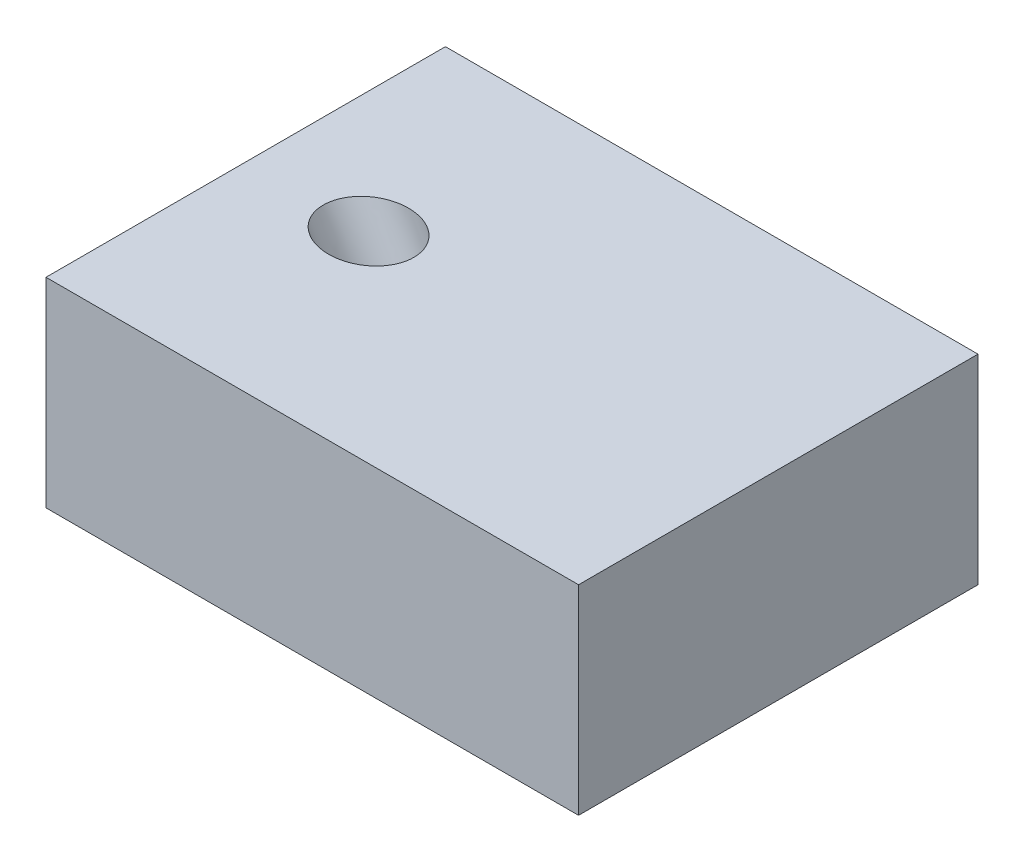
ISO-10303-21;
HEADER;
FILE_DESCRIPTION(('STEP AP214'),'2;1');
FILE_NAME('part.step','',(''),(''),'','','');
FILE_SCHEMA(('AUTOMOTIVE_DESIGN { 1 0 10303 214 1 1 1 1 }'));
ENDSEC;
DATA;
#1=APPLICATION_CONTEXT('core data for automotive mechanical design processes');
#2=APPLICATION_PROTOCOL_DEFINITION('international standard','automotive_design',2000,#1);
#3=PRODUCT_CONTEXT('',#1,'mechanical');
#4=PRODUCT('Part','Part','',(#3));
#5=PRODUCT_RELATED_PRODUCT_CATEGORY('part','',(#4));
#6=PRODUCT_DEFINITION_FORMATION('','',#4);
#7=PRODUCT_DEFINITION_CONTEXT('part definition',#1,'design');
#8=PRODUCT_DEFINITION('design','',#6,#7);
#9=PRODUCT_DEFINITION_SHAPE('','',#8);
#10=(LENGTH_UNIT() NAMED_UNIT(*) SI_UNIT(.MILLI.,.METRE.));
#11=(NAMED_UNIT(*) PLANE_ANGLE_UNIT() SI_UNIT($,.RADIAN.));
#12=(NAMED_UNIT(*) SI_UNIT($,.STERADIAN.) SOLID_ANGLE_UNIT());
#13=UNCERTAINTY_MEASURE_WITH_UNIT(LENGTH_MEASURE(1.E-05),#10,'distance_accuracy_value','');
#14=(GEOMETRIC_REPRESENTATION_CONTEXT(3) GLOBAL_UNCERTAINTY_ASSIGNED_CONTEXT((#13)) GLOBAL_UNIT_ASSIGNED_CONTEXT((#10,
#11,#12)) REPRESENTATION_CONTEXT('',''));
#15=CARTESIAN_POINT('',(0.,0.,0.));
#16=DIRECTION('',(0.,0.,1.));
#17=DIRECTION('',(1.,0.,0.));
#18=AXIS2_PLACEMENT_3D('',#15,#16,#17);
#19=CARTESIAN_POINT('',(0.,66.,0.));
#20=DIRECTION('',(0.,-1.,0.));
#21=DIRECTION('',(0.,0.,-1.));
#22=AXIS2_PLACEMENT_3D('',#19,#20,#21);
#23=PLANE('',#22);
#24=DIRECTION('',(0.,0.,1.));
#25=VECTOR('',#24,1.);
#26=CARTESIAN_POINT('',(-40.,66.,30.));
#27=LINE('',#26,#25);
#28=CARTESIAN_POINT('',(-40.,66.,-30.));
#29=VERTEX_POINT('',#28);
#30=CARTESIAN_POINT('',(-40.,66.,30.));
#31=VERTEX_POINT('',#30);
#32=EDGE_CURVE('E240',#29,#31,#27,.T.);
#33=ORIENTED_EDGE('',*,*,#32,.T.);
#34=DIRECTION('',(1.,0.,0.));
#35=VECTOR('',#34,1.);
#36=CARTESIAN_POINT('',(-40.,66.,30.));
#37=LINE('',#36,#35);
#38=CARTESIAN_POINT('',(40.,66.,30.));
#39=VERTEX_POINT('',#38);
#40=EDGE_CURVE('E235',#31,#39,#37,.T.);
#41=ORIENTED_EDGE('',*,*,#40,.T.);
#42=DIRECTION('',(0.,0.,-1.));
#43=VECTOR('',#42,1.);
#44=CARTESIAN_POINT('',(40.,66.,30.));
#45=LINE('',#44,#43);
#46=CARTESIAN_POINT('',(40.,66.,-30.));
#47=VERTEX_POINT('',#46);
#48=EDGE_CURVE('E238',#39,#47,#45,.T.);
#49=ORIENTED_EDGE('',*,*,#48,.T.);
#50=DIRECTION('',(-1.,0.,0.));
#51=VECTOR('',#50,1.);
#52=CARTESIAN_POINT('',(-40.,66.,-30.));
#53=LINE('',#52,#51);
#54=EDGE_CURVE('E205',#47,#29,#53,.T.);
#55=ORIENTED_EDGE('',*,*,#54,.T.);
#56=EDGE_LOOP('',(#33,#41,#49,#55));
#57=FACE_BOUND('',#56,.T.);
#58=CARTESIAN_POINT('',(-14.9545917454784,66.,-0.221368563252611));
#59=CARTESIAN_POINT('',(-14.9545929946342,66.,-0.371890879301488));
#60=CARTESIAN_POINT('',(-14.9610302799825,66.,-0.522444049297167));
#61=CARTESIAN_POINT('',(-14.9864821256718,66.,-0.819853633819207));
#62=CARTESIAN_POINT('',(-15.0052783884219,66.,-0.966729085467646));
#63=CARTESIAN_POINT('',(-15.0550325200086,66.,-1.25852998495501));
#64=CARTESIAN_POINT('',(-15.0860002838557,66.,-1.40345374674293));
#65=CARTESIAN_POINT('',(-15.1601783529055,66.,-1.69193582855216));
#66=CARTESIAN_POINT('',(-15.2035275137201,66.,-1.83545839330008));
#67=CARTESIAN_POINT('',(-15.3018502992551,66.,-2.11851819837684));
#68=CARTESIAN_POINT('',(-15.3568282424384,66.,-2.25805393624686));
#69=CARTESIAN_POINT('',(-15.4778941886963,66.,-2.53242212439155));
#70=CARTESIAN_POINT('',(-15.5439960659518,66.,-2.66724844413952));
#71=CARTESIAN_POINT('',(-15.6866284721866,66.,-2.93132083392915));
#72=CARTESIAN_POINT('',(-15.7631628124752,65.9999999999999,-3.06056484174546));
#73=CARTESIAN_POINT('',(-15.9296180727502,65.9999999999999,-3.31849279015927));
#74=CARTESIAN_POINT('',(-16.019987962611,66.,-3.44688687395068));
#75=CARTESIAN_POINT('',(-16.2105216315362,66.,-3.69626260261045));
#76=CARTESIAN_POINT('',(-16.3106895645196,66.,-3.81724106793311));
#77=CARTESIAN_POINT('',(-16.5198017981361,66.,-4.05108231462851));
#78=CARTESIAN_POINT('',(-16.6287352236948,66.,-4.16395483338286));
#79=CARTESIAN_POINT('',(-16.8546408577101,66.,-4.38135138133151));
#80=CARTESIAN_POINT('',(-16.9716138005161,66.,-4.48587464599381));
#81=CARTESIAN_POINT('',(-17.2238728808417,66.,-4.69547911521238));
#82=CARTESIAN_POINT('',(-17.3598534439979,66.,-4.79972505558473));
#83=CARTESIAN_POINT('',(-17.6392534849395,66.,-4.99748288528652));
#84=CARTESIAN_POINT('',(-17.7826679444969,66.,-5.0910018822546));
#85=CARTESIAN_POINT('',(-18.0760109646217,66.,-5.26714902834423));
#86=CARTESIAN_POINT('',(-18.225938652512,66.,-5.34977863053737));
#87=CARTESIAN_POINT('',(-18.5313598619439,66.,-5.50399738035659));
#88=CARTESIAN_POINT('',(-18.6868543642054,66.,-5.57558457070262));
#89=CARTESIAN_POINT('',(-19.160195462155,66.,-5.77351957105059));
#90=CARTESIAN_POINT('',(-19.4851862563706,66.,-5.88321137119391));
#91=CARTESIAN_POINT('',(-20.1467720768121,66.,-6.05734935002448));
#92=CARTESIAN_POINT('',(-20.4833653957303,66.,-6.12180215605005));
#93=CARTESIAN_POINT('',(-21.246909367318,66.,-6.21580918168374));
#94=CARTESIAN_POINT('',(-21.6754733630516,66.,-6.23266320910253));
#95=CARTESIAN_POINT('',(-22.5274173220886,66.,-6.19548947227423));
#96=CARTESIAN_POINT('',(-22.950812689407,66.,-6.14183338734177));
#97=CARTESIAN_POINT('',(-23.568433220711,66.,-6.01030766648476));
#98=CARTESIAN_POINT('',(-23.768628348964,65.9999999999999,-5.95904571080694));
#99=CARTESIAN_POINT('',(-24.1640571606445,66.0000000000001,-5.8401156123218));
#100=CARTESIAN_POINT('',(-24.3592929337989,66.0000000000002,-5.77245451071626));
#101=CARTESIAN_POINT('',(-24.7345065358018,66.0000000000001,-5.62432519107823));
#102=CARTESIAN_POINT('',(-24.9147733695349,65.9999999999999,-5.54458744069718));
#103=CARTESIAN_POINT('',(-25.2680182906407,66.0000000000001,-5.37048168498885));
#104=CARTESIAN_POINT('',(-25.44099970965,66.0000000000005,-5.27612046145902));
#105=CARTESIAN_POINT('',(-25.7687206022683,66.0000000000005,-5.07876350653369));
#106=CARTESIAN_POINT('',(-25.9239382085575,66.0000000000001,-4.97656168315661));
#107=CARTESIAN_POINT('',(-26.2253190052092,65.9999999999999,-4.75969069747982));
#108=CARTESIAN_POINT('',(-26.3714864086805,66.,-4.64502740587107));
#109=CARTESIAN_POINT('',(-26.6449682013593,66.,-4.41091823941033));
#110=CARTESIAN_POINT('',(-26.7728880823855,66.,-4.29217972719758));
#111=CARTESIAN_POINT('',(-27.0184045088524,66.,-4.04455547769387));
#112=CARTESIAN_POINT('',(-27.1360058291139,66.,-3.91567448667708));
#113=CARTESIAN_POINT('',(-27.3533269484785,65.9999999999999,-3.65602582901413));
#114=CARTESIAN_POINT('',(-27.4536863097124,65.9999999999998,-3.52579350413541));
#115=CARTESIAN_POINT('',(-27.6432382502915,66.0000000000002,-3.25748590155836));
#116=CARTESIAN_POINT('',(-27.7324344449991,66.0000000000008,-3.11941318426091));
#117=CARTESIAN_POINT('',(-27.8945961359281,66.0000000000007,-2.84322321411694));
#118=CARTESIAN_POINT('',(-27.9681487750246,66.0000000000001,-2.70545072562814));
#119=CARTESIAN_POINT('',(-28.103645406444,65.9999999999999,-2.42412739558337));
#120=CARTESIAN_POINT('',(-28.1655776364412,66.0000000000003,-2.28057087594818));
#121=CARTESIAN_POINT('',(-28.2757562064219,66.0000000000004,-1.99209085602575));
#122=CARTESIAN_POINT('',(-28.3242856750312,66.0000000000001,-1.84727556000084));
#123=CARTESIAN_POINT('',(-28.4089815785576,65.9999999999999,-1.55400240595177));
#124=CARTESIAN_POINT('',(-28.4451429387005,66.,-1.40554307945349));
#125=CARTESIAN_POINT('',(-28.5046370619288,66.,-1.10611036765524));
#126=CARTESIAN_POINT('',(-28.5279729954272,66.,-0.955137613184089));
#127=CARTESIAN_POINT('',(-28.5615357965762,66.,-0.651807695673855));
#128=CARTESIAN_POINT('',(-28.5717685983679,66.,-0.499451190813633));
#129=CARTESIAN_POINT('',(-28.5789307407562,66.,-0.198063730572169));
#130=CARTESIAN_POINT('',(-28.5761714535024,66.,-0.0490400955077483));
#131=CARTESIAN_POINT('',(-28.5581015092154,66.,0.248092928229653));
#132=CARTESIAN_POINT('',(-28.5428035178496,66.,0.396203087587097));
#133=CARTESIAN_POINT('',(-28.4998485437057,66.,0.690648009871579));
#134=CARTESIAN_POINT('',(-28.4721890502524,66.,0.836982405928537));
#135=CARTESIAN_POINT('',(-28.4048177768368,66.,1.12690106277195));
#136=CARTESIAN_POINT('',(-28.3651016368176,66.,1.27048430865428));
#137=CARTESIAN_POINT('',(-28.2735347786637,66.,1.55555929587865));
#138=CARTESIAN_POINT('',(-28.2215488804711,66.,1.69700756967071));
#139=CARTESIAN_POINT('',(-28.1062421946651,66.,1.97525974835984));
#140=CARTESIAN_POINT('',(-28.0429171996139,66.,2.11206190679618));
#141=CARTESIAN_POINT('',(-27.9055016797879,66.,2.380367569557));
#142=CARTESIAN_POINT('',(-27.8313971172867,66.,2.51186387463024));
#143=CARTESIAN_POINT('',(-27.6731655308693,66.,2.76873656686326));
#144=CARTESIAN_POINT('',(-27.5890348466627,66.,2.89411069527341));
#145=CARTESIAN_POINT('',(-27.4065680077183,66.,3.14491567150898));
#146=CARTESIAN_POINT('',(-27.3077016141501,66.,3.26996068150593));
#147=CARTESIAN_POINT('',(-27.1005045897662,66.,3.51202402344601));
#148=CARTESIAN_POINT('',(-26.9921699350837,66.,3.62903890462282));
#149=CARTESIAN_POINT('',(-26.7671043754966,66.,3.85439865459247));
#150=CARTESIAN_POINT('',(-26.6503838486187,66.,3.96275390083895));
#151=CARTESIAN_POINT('',(-26.4093003866682,66.,4.17060548555976));
#152=CARTESIAN_POINT('',(-26.2849367496291,66.,4.27010100826906));
#153=CARTESIAN_POINT('',(-26.0169298684503,66.,4.46923343929147));
#154=CARTESIAN_POINT('',(-25.872590261827,66.,4.56793380144712));
#155=CARTESIAN_POINT('',(-25.5769197960649,66.,4.75398179289634));
#156=CARTESIAN_POINT('',(-25.4255935469071,66.,4.84133676708776));
#157=CARTESIAN_POINT('',(-25.1168946790263,66.,5.0045724614058));
#158=CARTESIAN_POINT('',(-24.9595227130482,66.,5.08045441591092));
#159=CARTESIAN_POINT('',(-24.6397063012743,66.,5.22062078627566));
#160=CARTESIAN_POINT('',(-24.477261142739,66.,5.28490356387475));
#161=CARTESIAN_POINT('',(-23.9838618398844,66.,5.46013663680507));
#162=CARTESIAN_POINT('',(-23.6465523659112,66.,5.55362440671631));
#163=CARTESIAN_POINT('',(-22.8864861273947,66.,5.70891353726074));
#164=CARTESIAN_POINT('',(-22.4613606377431,66.,5.75909971675453));
#165=CARTESIAN_POINT('',(-21.6084984607024,66.,5.78878748014896));
#166=CARTESIAN_POINT('',(-21.1807619376758,66.,5.7682934684271));
#167=CARTESIAN_POINT('',(-20.5498626077058,66.,5.68517557689914));
#168=CARTESIAN_POINT('',(-20.3428777299125,66.,5.64920582308319));
#169=CARTESIAN_POINT('',(-19.9326257171018,66.,5.56023874275921));
#170=CARTESIAN_POINT('',(-19.7293570680001,65.9999999999999,5.50724852193536));
#171=CARTESIAN_POINT('',(-19.3357236293609,66.,5.38667409820192));
#172=CARTESIAN_POINT('',(-19.1451629463452,66.0000000000001,5.31972763168865));
#173=CARTESIAN_POINT('',(-18.7703112748475,65.9999999999999,5.17029993082986));
#174=CARTESIAN_POINT('',(-18.586017487523,65.9999999999997,5.08782574178272));
#175=CARTESIAN_POINT('',(-18.2345828127306,65.9999999999997,4.91224509699851));
#176=CARTESIAN_POINT('',(-18.0670493724017,65.9999999999999,4.8199242830914));
#177=CARTESIAN_POINT('',(-17.7402659719961,66.0000000000001,4.6217574463017));
#178=CARTESIAN_POINT('',(-17.5810121843883,66.,4.51591775259578));
#179=CARTESIAN_POINT('',(-17.2813206532769,66.,4.29772244742905));
#180=CARTESIAN_POINT('',(-17.1403271605685,66.,4.1861301931629));
#181=CARTESIAN_POINT('',(-16.868119131663,66.,3.95169075977158));
#182=CARTESIAN_POINT('',(-16.7369000473516,65.9999999999999,3.82884887526993));
#183=CARTESIAN_POINT('',(-16.492946612656,66.0000000000001,3.58004710868649));
#184=CARTESIAN_POINT('',(-16.3795764849318,66.0000000000003,3.45471065704271));
#185=CARTESIAN_POINT('',(-16.1636450079686,65.9999999999997,3.19510685313406));
#186=CARTESIAN_POINT('',(-16.0610796435329,65.999999999999,3.06084284894));
#187=CARTESIAN_POINT('',(-15.8730468607526,65.9999999999991,2.79158806765869));
#188=CARTESIAN_POINT('',(-15.7869524472458,65.9999999999999,2.65703518354623));
#189=CARTESIAN_POINT('',(-15.6261143420114,66.0000000000001,2.38108249728747));
#190=CARTESIAN_POINT('',(-15.5513840160681,65.9999999999995,2.23967488676656));
#191=CARTESIAN_POINT('',(-15.4162317306501,65.9999999999994,1.95524505468059));
#192=CARTESIAN_POINT('',(-15.3554544860795,65.9999999999998,1.81239174294644));
#193=CARTESIAN_POINT('',(-15.2461341175836,66.0000000000002,1.5219952981639));
#194=CARTESIAN_POINT('',(-15.1975964494311,66.,1.37445010659924));
#195=CARTESIAN_POINT('',(-15.1134022081633,66.,1.07587559395705));
#196=CARTESIAN_POINT('',(-15.0777337959484,66.,0.924849611844721));
#197=CARTESIAN_POINT('',(-15.0196717808136,66.,0.620343032961607));
#198=CARTESIAN_POINT('',(-14.9972697992109,66.,0.466864048480604));
#199=CARTESIAN_POINT('',(-14.9726258630974,66.,0.22397773000751));
#200=CARTESIAN_POINT('',(-14.9658632090758,66.,0.135006495739616));
#201=CARTESIAN_POINT('',(-14.9568475132208,66.,-0.0430958568584453));
#202=CARTESIAN_POINT('',(-14.9545910057081,66.,-0.132226799505812));
#203=CARTESIAN_POINT('',(-14.9545917454784,66.,-0.221368563252611));
#204=B_SPLINE_CURVE_WITH_KNOTS('',3,(#58,#59,#60,#61,#62,#63,#64,#65,#66,#67,#68,#69,#70,#71,
#72,#73,#74,#75,#76,#77,#78,#79,#80,#81,#82,#83,#84,#85,#86,#87,#88,#89,#90,#91,#92,#93,#94,#95,
#96,#97,#98,#99,#100,#101,#102,#103,#104,#105,#106,#107,#108,#109,#110,#111,#112,#113,#114,#115,
#116,#117,#118,#119,#120,#121,#122,#123,#124,#125,#126,#127,#128,#129,#130,#131,#132,#133,#134,
#135,#136,#137,#138,#139,#140,#141,#142,#143,#144,#145,#146,#147,#148,#149,#150,#151,#152,#153,
#154,#155,#156,#157,#158,#159,#160,#161,#162,#163,#164,#165,#166,#167,#168,#169,#170,#171,#172,
#173,#174,#175,#176,#177,#178,#179,#180,#181,#182,#183,#184,#185,#186,#187,#188,#189,#190,#191,
#192,#193,#194,#195,#196,#197,#198,#199,#200,#201,#202,#203),.UNSPECIFIED.,.T.,.F.,(4,2,2,2,2,2,
2,2,2,2,2,2,2,2,2,2,2,2,2,2,2,2,2,2,2,2,2,2,2,2,2,2,2,2,2,2,2,2,2,2,2,2,2,2,2,2,2,2,2,2,2,2,2,2,
2,2,2,2,2,2,2,2,2,2,2,2,2,2,2,2,2,2,4),(0.,0.451482245326943,0.895196736477731,1.33927270081871,
1.78853884284352,2.23797211812093,2.68797015503113,3.13813303331012,3.60866132187029,
4.07938996454401,4.54954333642447,5.01973971049693,5.53324220839058,6.04640247131372,
6.55949418908286,7.07267674869428,8.09805032553818,9.12327365773496,10.4039964717244,
11.6779952292428,12.2973802830935,12.9164998649991,13.5071995168006,14.0976260403899,
14.6545457525779,15.211204223824,15.7342350097846,16.2570224772988,16.7497263581932,
17.2422702541797,17.7102811581371,18.1787632627822,18.6364220361584,19.0942683674382,
19.5520014693005,20.0095271997695,20.456144324319,20.9023108646116,21.348568064492,
21.7949868374332,22.2465746395924,22.6983303545754,23.150679725884,23.6031947476566,
24.080915673334,24.5588406196466,25.0361839678911,25.5135712224977,26.0376151858072,
26.5613181786715,27.0849647863431,27.6086852957425,28.6551481763674,29.9335445836396,
31.2118613301395,31.8415367971369,32.4709497289035,33.0762205163619,33.6812173369673,
34.2544477997145,34.8274108683226,35.3662538272057,35.9048444710963,36.4112974143152,
36.9175614838686,37.3962510998821,37.8754994395415,38.340695897188,38.8060993503647,
39.271073556348,39.7357537844068,40.0033347893066,40.2707099181595),.UNSPECIFIED.);
#205=CARTESIAN_POINT('',(-14.9545917454784,66.,-0.221368563252611));
#206=VERTEX_POINT('',#205);
#207=EDGE_CURVE('E256',#206,#206,#204,.T.);
#208=ORIENTED_EDGE('',*,*,#207,.F.);
#209=EDGE_LOOP('',(#208));
#210=FACE_BOUND('',#209,.T.);
#211=ADVANCED_FACE('F182',(#57,#210),#23,.F.);
#212=CARTESIAN_POINT('',(0.,36.,0.));
#213=DIRECTION('',(0.,-1.,0.));
#214=DIRECTION('',(0.,0.,-1.));
#215=AXIS2_PLACEMENT_3D('',#212,#213,#214);
#216=PLANE('',#215);
#217=DIRECTION('',(0.,0.,1.));
#218=VECTOR('',#217,1.);
#219=CARTESIAN_POINT('',(-40.,36.,30.));
#220=LINE('',#219,#218);
#221=CARTESIAN_POINT('',(-40.,36.,-30.));
#222=VERTEX_POINT('',#221);
#223=CARTESIAN_POINT('',(-40.,36.,30.));
#224=VERTEX_POINT('',#223);
#225=EDGE_CURVE('E253',#222,#224,#220,.T.);
#226=ORIENTED_EDGE('',*,*,#225,.F.);
#227=DIRECTION('',(-1.,0.,0.));
#228=VECTOR('',#227,1.);
#229=CARTESIAN_POINT('',(-40.,36.,-30.));
#230=LINE('',#229,#228);
#231=CARTESIAN_POINT('',(40.,36.,-30.));
#232=VERTEX_POINT('',#231);
#233=EDGE_CURVE('E228',#232,#222,#230,.T.);
#234=ORIENTED_EDGE('',*,*,#233,.F.);
#235=DIRECTION('',(0.,0.,-1.));
#236=VECTOR('',#235,1.);
#237=CARTESIAN_POINT('',(40.,36.,30.));
#238=LINE('',#237,#236);
#239=CARTESIAN_POINT('',(40.,36.,30.));
#240=VERTEX_POINT('',#239);
#241=EDGE_CURVE('E222',#240,#232,#238,.T.);
#242=ORIENTED_EDGE('',*,*,#241,.F.);
#243=DIRECTION('',(1.,0.,0.));
#244=VECTOR('',#243,1.);
#245=CARTESIAN_POINT('',(-40.,36.,30.));
#246=LINE('',#245,#244);
#247=EDGE_CURVE('E244',#224,#240,#246,.T.);
#248=ORIENTED_EDGE('',*,*,#247,.F.);
#249=EDGE_LOOP('',(#226,#234,#242,#248));
#250=FACE_BOUND('',#249,.T.);
#251=CARTESIAN_POINT('',(3.3627801501831,36.,-0.221368563252611));
#252=CARTESIAN_POINT('',(3.36277890102735,36.,-0.371890879301488));
#253=CARTESIAN_POINT('',(3.35634161567906,36.,-0.522444049297167));
#254=CARTESIAN_POINT('',(3.33088976998974,36.,-0.819853633819206));
#255=CARTESIAN_POINT('',(3.31209350723966,36.,-0.966729085467646));
#256=CARTESIAN_POINT('',(3.26233937565294,36.,-1.25852998495501));
#257=CARTESIAN_POINT('',(3.23137161180587,36.,-1.40345374674293));
#258=CARTESIAN_POINT('',(3.15719354275601,36.,-1.69193582855216));
#259=CARTESIAN_POINT('',(3.11384438194142,36.,-1.83545839330008));
#260=CARTESIAN_POINT('',(3.01552159640644,36.,-2.11851819837685));
#261=CARTESIAN_POINT('',(2.96054365322311,36.,-2.25805393624686));
#262=CARTESIAN_POINT('',(2.83947770696525,36.,-2.53242212439155));
#263=CARTESIAN_POINT('',(2.77337582970977,36.,-2.66724844413953));
#264=CARTESIAN_POINT('',(2.63074342347498,36.,-2.93132083392915));
#265=CARTESIAN_POINT('',(2.55420908318631,35.9999999999999,-3.06056484174547));
#266=CARTESIAN_POINT('',(2.38775382291131,35.9999999999999,-3.31849279015928));
#267=CARTESIAN_POINT('',(2.29738393305056,36.,-3.44688687395068));
#268=CARTESIAN_POINT('',(2.10685026412533,36.,-3.69626260261046));
#269=CARTESIAN_POINT('',(2.00668233114198,36.,-3.81724106793311));
#270=CARTESIAN_POINT('',(1.79757009752545,36.,-4.05108231462851));
#271=CARTESIAN_POINT('',(1.68863667196679,36.,-4.16395483338286));
#272=CARTESIAN_POINT('',(1.46273103795147,36.,-4.38135138133151));
#273=CARTESIAN_POINT('',(1.34575809514543,36.,-4.48587464599381));
#274=CARTESIAN_POINT('',(1.09349901481986,36.,-4.69547911521238));
#275=CARTESIAN_POINT('',(0.957518451663614,36.,-4.79972505558473));
#276=CARTESIAN_POINT('',(0.67811841072207,36.,-4.99748288528652));
#277=CARTESIAN_POINT('',(0.534703951164616,36.,-5.0910018822546));
#278=CARTESIAN_POINT('',(0.241360931039886,36.,-5.26714902834423));
#279=CARTESIAN_POINT('',(0.091433243149579,36.,-5.34977863053737));
#280=CARTESIAN_POINT('',(-0.213987966282339,36.,-5.5039973803566));
#281=CARTESIAN_POINT('',(-0.369482468543817,36.,-5.57558457070261));
#282=CARTESIAN_POINT('',(-0.842823566493473,36.,-5.77351957105059));
#283=CARTESIAN_POINT('',(-1.16781436070902,36.,-5.88321137119391));
#284=CARTESIAN_POINT('',(-1.8294001811506,36.,-6.05734935002448));
#285=CARTESIAN_POINT('',(-2.16599350006877,36.,-6.12180215605005));
#286=CARTESIAN_POINT('',(-2.92953747165647,36.,-6.21580918168374));
#287=CARTESIAN_POINT('',(-3.35810146739005,36.,-6.23266320910253));
#288=CARTESIAN_POINT('',(-4.21004542642708,36.,-6.19548947227423));
#289=CARTESIAN_POINT('',(-4.63344079374542,36.,-6.14183338734177));
#290=CARTESIAN_POINT('',(-5.25106132504941,36.,-6.01030766648476));
#291=CARTESIAN_POINT('',(-5.45125645330242,35.9999999999999,-5.95904571080694));
#292=CARTESIAN_POINT('',(-5.84668526498291,36.,-5.84011561232181));
#293=CARTESIAN_POINT('',(-6.04192103813734,36.0000000000002,-5.77245451071626));
#294=CARTESIAN_POINT('',(-6.41713464014024,36.0000000000001,-5.62432519107824));
#295=CARTESIAN_POINT('',(-6.59740147387334,35.9999999999999,-5.54458744069719));
#296=CARTESIAN_POINT('',(-6.9506463949792,36.0000000000001,-5.37048168498885));
#297=CARTESIAN_POINT('',(-7.12362781398841,36.0000000000005,-5.27612046145903));
#298=CARTESIAN_POINT('',(-7.4513487066068,36.0000000000005,-5.0787635065337));
#299=CARTESIAN_POINT('',(-7.60656631289591,36.0000000000001,-4.97656168315662));
#300=CARTESIAN_POINT('',(-7.90794710954767,35.9999999999999,-4.75969069747982));
#301=CARTESIAN_POINT('',(-8.05411451301897,36.,-4.64502740587107));
#302=CARTESIAN_POINT('',(-8.32759630569777,36.,-4.41091823941033));
#303=CARTESIAN_POINT('',(-8.45551618672395,36.,-4.29217972719758));
#304=CARTESIAN_POINT('',(-8.7010326131909,36.,-4.04455547769387));
#305=CARTESIAN_POINT('',(-8.81863393345239,36.0000000000001,-3.91567448667708));
#306=CARTESIAN_POINT('',(-9.035955052817,36.,-3.65602582901413));
#307=CARTESIAN_POINT('',(-9.13631441405082,35.9999999999998,-3.52579350413541));
#308=CARTESIAN_POINT('',(-9.32586635462994,36.0000000000002,-3.25748590155837));
#309=CARTESIAN_POINT('',(-9.41506254933758,36.0000000000009,-3.11941318426091));
#310=CARTESIAN_POINT('',(-9.57722424026651,36.0000000000008,-2.84322321411694));
#311=CARTESIAN_POINT('',(-9.65077687936306,36.0000000000001,-2.70545072562814));
#312=CARTESIAN_POINT('',(-9.78627351078243,35.9999999999999,-2.42412739558337));
#313=CARTESIAN_POINT('',(-9.84820574077969,36.0000000000003,-2.28057087594818));
#314=CARTESIAN_POINT('',(-9.95838431076032,36.0000000000004,-1.99209085602575));
#315=CARTESIAN_POINT('',(-10.0069137793696,36.0000000000001,-1.84727556000085));
#316=CARTESIAN_POINT('',(-10.091609682896,35.9999999999999,-1.55400240595177));
#317=CARTESIAN_POINT('',(-10.1277710430389,36.,-1.40554307945349));
#318=CARTESIAN_POINT('',(-10.1872651662673,36.,-1.10611036765524));
#319=CARTESIAN_POINT('',(-10.2106010997657,36.,-0.955137613184087));
#320=CARTESIAN_POINT('',(-10.2441639009146,36.,-0.651807695673852));
#321=CARTESIAN_POINT('',(-10.2543967027064,36.,-0.499451190813631));
#322=CARTESIAN_POINT('',(-10.2615588450947,36.,-0.198063730572166));
#323=CARTESIAN_POINT('',(-10.2587995578409,36.,-0.0490400955077456));
#324=CARTESIAN_POINT('',(-10.2407296135539,36.,0.248092928229655));
#325=CARTESIAN_POINT('',(-10.2254316221881,36.,0.396203087587099));
#326=CARTESIAN_POINT('',(-10.1824766480442,36.,0.690648009871582));
#327=CARTESIAN_POINT('',(-10.1548171545909,36.,0.836982405928539));
#328=CARTESIAN_POINT('',(-10.0874458811752,36.,1.12690106277195));
#329=CARTESIAN_POINT('',(-10.047729741156,36.,1.27048430865428));
#330=CARTESIAN_POINT('',(-9.9561628830022,36.,1.55555929587866));
#331=CARTESIAN_POINT('',(-9.90417698480958,36.,1.69700756967072));
#332=CARTESIAN_POINT('',(-9.78887029900357,36.,1.97525974835985));
#333=CARTESIAN_POINT('',(-9.7255453039524,36.,2.11206190679618));
#334=CARTESIAN_POINT('',(-9.58812978412639,36.,2.380367569557));
#335=CARTESIAN_POINT('',(-9.51402522162511,36.,2.51186387463024));
#336=CARTESIAN_POINT('',(-9.35579363520774,36.,2.76873656686326));
#337=CARTESIAN_POINT('',(-9.27166295100115,36.,2.89411069527341));
#338=CARTESIAN_POINT('',(-9.08919611205671,36.,3.14491567150898));
#339=CARTESIAN_POINT('',(-8.99032971848857,36.,3.26996068150594));
#340=CARTESIAN_POINT('',(-8.78313269410464,36.,3.51202402344602));
#341=CARTESIAN_POINT('',(-8.67479803942212,36.,3.62903890462282));
#342=CARTESIAN_POINT('',(-8.449732479835,36.,3.85439865459247));
#343=CARTESIAN_POINT('',(-8.33301195295716,36.,3.96275390083895));
#344=CARTESIAN_POINT('',(-8.09192849100661,36.,4.17060548555976));
#345=CARTESIAN_POINT('',(-7.96756485396756,36.,4.27010100826906));
#346=CARTESIAN_POINT('',(-7.69955797278871,36.,4.46923343929147));
#347=CARTESIAN_POINT('',(-7.55521836616544,36.,4.56793380144712));
#348=CARTESIAN_POINT('',(-7.25954790040338,36.,4.75398179289634));
#349=CARTESIAN_POINT('',(-7.10822165124553,36.,4.84133676708776));
#350=CARTESIAN_POINT('',(-6.79952278336477,36.,5.0045724614058));
#351=CARTESIAN_POINT('',(-6.64215081738662,36.,5.08045441591093));
#352=CARTESIAN_POINT('',(-6.32233440561276,36.,5.22062078627567));
#353=CARTESIAN_POINT('',(-6.15988924707744,36.,5.28490356387475));
#354=CARTESIAN_POINT('',(-5.66648994422288,36.,5.46013663680507));
#355=CARTESIAN_POINT('',(-5.32918047024962,36.,5.55362440671631));
#356=CARTESIAN_POINT('',(-4.5691142317331,36.,5.70891353726074));
#357=CARTESIAN_POINT('',(-4.1439887420815,36.,5.75909971675453));
#358=CARTESIAN_POINT('',(-3.29112656504089,36.,5.78878748014896));
#359=CARTESIAN_POINT('',(-2.86339004201429,36.,5.7682934684271));
#360=CARTESIAN_POINT('',(-2.23249071204429,36.,5.68517557689914));
#361=CARTESIAN_POINT('',(-2.02550583425099,36.,5.64920582308319));
#362=CARTESIAN_POINT('',(-1.61525382144025,36.,5.56023874275921));
#363=CARTESIAN_POINT('',(-1.41198517233851,35.9999999999999,5.50724852193536));
#364=CARTESIAN_POINT('',(-1.01835173369939,36.,5.38667409820192));
#365=CARTESIAN_POINT('',(-0.82779105068368,36.0000000000001,5.31972763168865));
#366=CARTESIAN_POINT('',(-0.452939379185981,35.9999999999999,5.17029993082986));
#367=CARTESIAN_POINT('',(-0.268645591861471,35.9999999999997,5.08782574178272));
#368=CARTESIAN_POINT('',(0.0827890829309123,35.9999999999997,4.91224509699851));
#369=CARTESIAN_POINT('',(0.250322523259815,35.9999999999999,4.8199242830914));
#370=CARTESIAN_POINT('',(0.57710592366541,36.0000000000001,4.62175744630169));
#371=CARTESIAN_POINT('',(0.736359711273253,36.,4.51591775259577));
#372=CARTESIAN_POINT('',(1.0360512423847,36.,4.29772244742905));
#373=CARTESIAN_POINT('',(1.17704473509303,36.,4.1861301931629));
#374=CARTESIAN_POINT('',(1.44925276399852,36.,3.95169075977158));
#375=CARTESIAN_POINT('',(1.58047184830993,35.9999999999999,3.82884887526993));
#376=CARTESIAN_POINT('',(1.82442528300557,36.0000000000001,3.58004710868649));
#377=CARTESIAN_POINT('',(1.9377954107297,36.0000000000003,3.45471065704271));
#378=CARTESIAN_POINT('',(2.15372688769294,35.9999999999997,3.19510685313406));
#379=CARTESIAN_POINT('',(2.25629225212861,35.999999999999,3.06084284894));
#380=CARTESIAN_POINT('',(2.44432503490897,35.9999999999991,2.79158806765868));
#381=CARTESIAN_POINT('',(2.53041944841579,35.9999999999999,2.65703518354623));
#382=CARTESIAN_POINT('',(2.69125755365018,36.0000000000001,2.38108249728747));
#383=CARTESIAN_POINT('',(2.7659878795934,35.9999999999995,2.23967488676656));
#384=CARTESIAN_POINT('',(2.90114016501149,35.9999999999994,1.95524505468058));
#385=CARTESIAN_POINT('',(2.96191740958202,35.9999999999998,1.81239174294644));
#386=CARTESIAN_POINT('',(3.07123777807794,36.0000000000002,1.5219952981639));
#387=CARTESIAN_POINT('',(3.11977544623047,36.,1.37445010659924));
#388=CARTESIAN_POINT('',(3.20396968749827,36.,1.07587559395705));
#389=CARTESIAN_POINT('',(3.23963809971313,36.,0.924849611844718));
#390=CARTESIAN_POINT('',(3.29770011484799,36.,0.620343032961605));
#391=CARTESIAN_POINT('',(3.3201020964507,36.,0.466864048480603));
#392=CARTESIAN_POINT('',(3.3447460325642,36.,0.223977730007509));
#393=CARTESIAN_POINT('',(3.35150868658575,36.,0.135006495739616));
#394=CARTESIAN_POINT('',(3.36052438244077,36.,-0.0430958568584457));
#395=CARTESIAN_POINT('',(3.36278088995345,36.,-0.132226799505812));
#396=CARTESIAN_POINT('',(3.3627801501831,36.,-0.221368563252611));
#397=B_SPLINE_CURVE_WITH_KNOTS('',3,(#251,#252,#253,#254,#255,#256,#257,#258,#259,#260,#261,
#262,#263,#264,#265,#266,#267,#268,#269,#270,#271,#272,#273,#274,#275,#276,#277,#278,#279,#280,
#281,#282,#283,#284,#285,#286,#287,#288,#289,#290,#291,#292,#293,#294,#295,#296,#297,#298,#299,
#300,#301,#302,#303,#304,#305,#306,#307,#308,#309,#310,#311,#312,#313,#314,#315,#316,#317,#318,
#319,#320,#321,#322,#323,#324,#325,#326,#327,#328,#329,#330,#331,#332,#333,#334,#335,#336,#337,
#338,#339,#340,#341,#342,#343,#344,#345,#346,#347,#348,#349,#350,#351,#352,#353,#354,#355,#356,
#357,#358,#359,#360,#361,#362,#363,#364,#365,#366,#367,#368,#369,#370,#371,#372,#373,#374,#375,
#376,#377,#378,#379,#380,#381,#382,#383,#384,#385,#386,#387,#388,#389,#390,#391,#392,#393,#394,
#395,#396),.UNSPECIFIED.,.T.,.F.,(4,2,2,2,2,2,2,2,2,2,2,2,2,2,2,2,2,2,2,2,2,2,2,2,2,2,2,2,2,2,2,
2,2,2,2,2,2,2,2,2,2,2,2,2,2,2,2,2,2,2,2,2,2,2,2,2,2,2,2,2,2,2,2,2,2,2,2,2,2,2,2,2,4),(0.,
0.451482245326943,0.895196736477732,1.33927270081871,1.78853884284352,2.23797211812093,
2.68797015503113,3.13813303331012,3.60866132187029,4.07938996454401,4.54954333642447,
5.01973971049693,5.53324220839058,6.04640247131372,6.55949418908286,7.07267674869428,
8.09805032553818,9.12327365773496,10.4039964717244,11.6779952292428,12.2973802830935,
12.9164998649991,13.5071995168005,14.0976260403898,14.6545457525779,15.211204223824,
15.7342350097846,16.2570224772988,16.7497263581932,17.2422702541797,17.7102811581371,
18.1787632627822,18.6364220361584,19.0942683674382,19.5520014693005,20.0095271997695,
20.4561443243191,20.9023108646116,21.3485680644921,21.7949868374332,22.2465746395924,
22.6983303545754,23.150679725884,23.6031947476567,24.080915673334,24.5588406196466,
25.0361839678911,25.5135712224977,26.0376151858072,26.5613181786715,27.0849647863431,
27.6086852957425,28.6551481763674,29.9335445836396,31.2118613301395,31.8415367971369,
32.4709497289035,33.0762205163619,33.6812173369673,34.2544477997145,34.8274108683226,
35.3662538272057,35.9048444710963,36.4112974143152,36.9175614838686,37.3962510998821,
37.8754994395415,38.340695897188,38.8060993503647,39.271073556348,39.7357537844067,
40.0033347893066,40.2707099181595),.UNSPECIFIED.);
#398=CARTESIAN_POINT('',(3.3627801501831,36.,-0.221368563252611));
#399=VERTEX_POINT('',#398);
#400=EDGE_CURVE('E186',#399,#399,#397,.T.);
#401=ORIENTED_EDGE('',*,*,#400,.T.);
#402=EDGE_LOOP('',(#401));
#403=FACE_BOUND('',#402,.T.);
#404=ADVANCED_FACE('F264',(#250,#403),#216,.T.);
#405=CARTESIAN_POINT('',(-40.,66.,30.));
#406=DIRECTION('',(1.,0.,0.));
#407=DIRECTION('',(0.,0.,-1.));
#408=AXIS2_PLACEMENT_3D('',#405,#406,#407);
#409=PLANE('',#408);
#410=ORIENTED_EDGE('',*,*,#225,.T.);
#411=DIRECTION('',(0.,-1.,0.));
#412=VECTOR('',#411,1.);
#413=CARTESIAN_POINT('',(-40.,66.,30.));
#414=LINE('',#413,#412);
#415=EDGE_CURVE('E13',#31,#224,#414,.T.);
#416=ORIENTED_EDGE('',*,*,#415,.F.);
#417=ORIENTED_EDGE('',*,*,#32,.F.);
#418=DIRECTION('',(0.,-1.,0.));
#419=VECTOR('',#418,1.);
#420=CARTESIAN_POINT('',(-40.,66.,-30.));
#421=LINE('',#420,#419);
#422=EDGE_CURVE('E249',#29,#222,#421,.T.);
#423=ORIENTED_EDGE('',*,*,#422,.T.);
#424=EDGE_LOOP('',(#410,#416,#417,#423));
#425=FACE_BOUND('',#424,.T.);
#426=ADVANCED_FACE('F184',(#425),#409,.F.);
#427=CARTESIAN_POINT('',(-40.,66.,30.));
#428=DIRECTION('',(0.,0.,-1.));
#429=DIRECTION('',(-1.,0.,0.));
#430=AXIS2_PLACEMENT_3D('',#427,#428,#429);
#431=PLANE('',#430);
#432=ORIENTED_EDGE('',*,*,#247,.T.);
#433=DIRECTION('',(0.,-1.,0.));
#434=VECTOR('',#433,1.);
#435=CARTESIAN_POINT('',(40.,66.,30.));
#436=LINE('',#435,#434);
#437=EDGE_CURVE('E197',#39,#240,#436,.T.);
#438=ORIENTED_EDGE('',*,*,#437,.F.);
#439=ORIENTED_EDGE('',*,*,#40,.F.);
#440=ORIENTED_EDGE('',*,*,#415,.T.);
#441=EDGE_LOOP('',(#432,#438,#439,#440));
#442=FACE_BOUND('',#441,.T.);
#443=ADVANCED_FACE('F243',(#442),#431,.F.);
#444=CARTESIAN_POINT('',(40.,66.,30.));
#445=DIRECTION('',(-1.,0.,0.));
#446=DIRECTION('',(0.,0.,1.));
#447=AXIS2_PLACEMENT_3D('',#444,#445,#446);
#448=PLANE('',#447);
#449=ORIENTED_EDGE('',*,*,#241,.T.);
#450=DIRECTION('',(0.,-1.,0.));
#451=VECTOR('',#450,1.);
#452=CARTESIAN_POINT('',(40.,66.,-30.));
#453=LINE('',#452,#451);
#454=EDGE_CURVE('E245',#47,#232,#453,.T.);
#455=ORIENTED_EDGE('',*,*,#454,.F.);
#456=ORIENTED_EDGE('',*,*,#48,.F.);
#457=ORIENTED_EDGE('',*,*,#437,.T.);
#458=EDGE_LOOP('',(#449,#455,#456,#457));
#459=FACE_BOUND('',#458,.T.);
#460=ADVANCED_FACE('F247',(#459),#448,.F.);
#461=CARTESIAN_POINT('',(-40.,66.,-30.));
#462=DIRECTION('',(0.,0.,1.));
#463=DIRECTION('',(1.,0.,0.));
#464=AXIS2_PLACEMENT_3D('',#461,#462,#463);
#465=PLANE('',#464);
#466=ORIENTED_EDGE('',*,*,#233,.T.);
#467=ORIENTED_EDGE('',*,*,#422,.F.);
#468=ORIENTED_EDGE('',*,*,#54,.F.);
#469=ORIENTED_EDGE('',*,*,#454,.T.);
#470=EDGE_LOOP('',(#466,#467,#468,#469));
#471=FACE_BOUND('',#470,.T.);
#472=ADVANCED_FACE('F261',(#471),#465,.F.);
#473=CARTESIAN_POINT('',(-17.3505878743022,58.7689129788524,-0.221368563252611));
#474=DIRECTION('',(0.293589123508279,-0.955931706011282,0.));
#475=DIRECTION('',(0.955931706011282,0.293589123508279,0.));
#476=AXIS2_PLACEMENT_3D('',#473,#474,#475);
#477=CIRCLE('',#476,6.);
#478=DIRECTION('',(-0.521119348849061,0.853483816047575,0.));
#479=VECTOR('',#478,1.);
#480=SURFACE_OF_LINEAR_EXTRUSION('',#477,#479);
#481=ORIENTED_EDGE('',*,*,#400,.F.);
#482=EDGE_LOOP('',(#481));
#483=FACE_BOUND('',#482,.T.);
#484=ORIENTED_EDGE('',*,*,#207,.T.);
#485=EDGE_LOOP('',(#484));
#486=FACE_BOUND('',#485,.T.);
#487=ADVANCED_FACE('F276',(#483,#486),#480,.T.);
#488=CLOSED_SHELL('',(#211,#404,#426,#443,#460,#472,#487));
#489=MANIFOLD_SOLID_BREP('B2',#488);
#490=ADVANCED_BREP_SHAPE_REPRESENTATION('',(#18,#489),#14);
#491=SHAPE_DEFINITION_REPRESENTATION(#9,#490);
ENDSEC;
END-ISO-10303-21;
